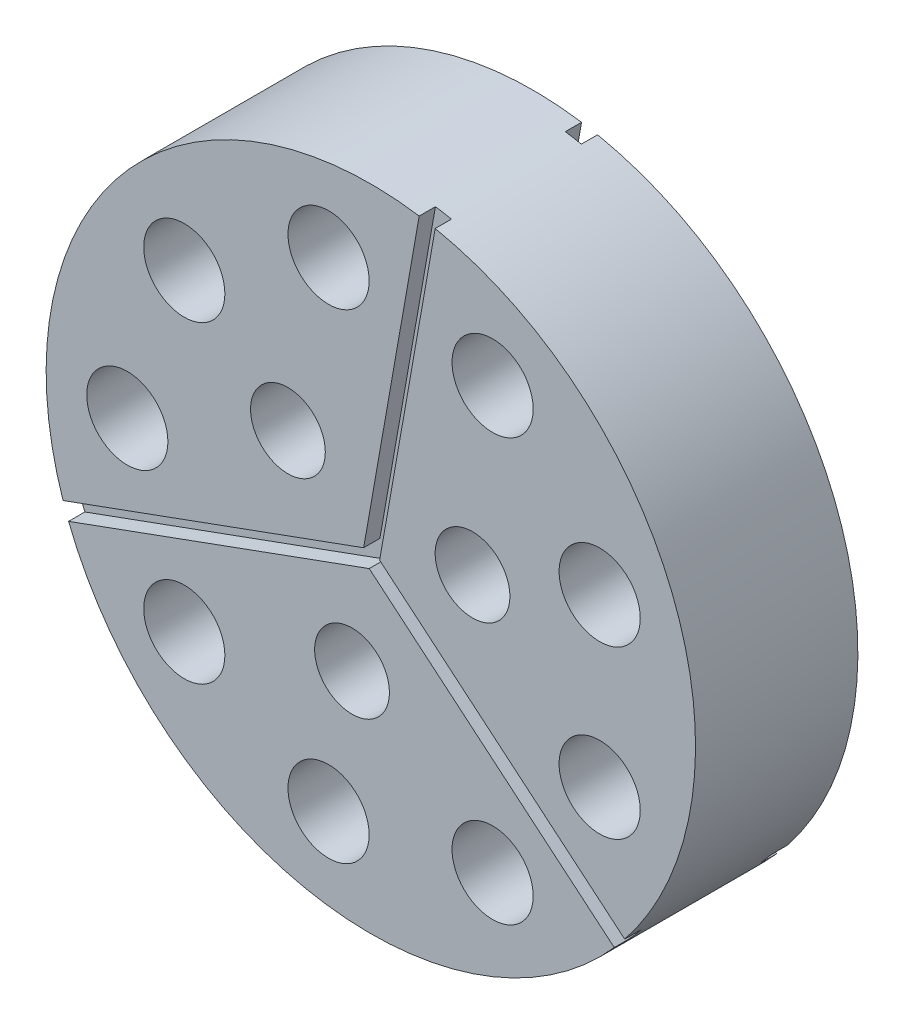
ISO-10303-21;
HEADER;
FILE_DESCRIPTION(('STEP AP214'),'2;1');
FILE_NAME('part.step','',(''),(''),'','','');
FILE_SCHEMA(('AUTOMOTIVE_DESIGN { 1 0 10303 214 1 1 1 1 }'));
ENDSEC;
DATA;
#1=APPLICATION_CONTEXT('core data for automotive mechanical design processes');
#2=APPLICATION_PROTOCOL_DEFINITION('international standard','automotive_design',2000,#1);
#3=PRODUCT_CONTEXT('',#1,'mechanical');
#4=PRODUCT('Part','Part','',(#3));
#5=PRODUCT_RELATED_PRODUCT_CATEGORY('part','',(#4));
#6=PRODUCT_DEFINITION_FORMATION('','',#4);
#7=PRODUCT_DEFINITION_CONTEXT('part definition',#1,'design');
#8=PRODUCT_DEFINITION('design','',#6,#7);
#9=PRODUCT_DEFINITION_SHAPE('','',#8);
#10=(LENGTH_UNIT() NAMED_UNIT(*) SI_UNIT(.MILLI.,.METRE.));
#11=(NAMED_UNIT(*) PLANE_ANGLE_UNIT() SI_UNIT($,.RADIAN.));
#12=(NAMED_UNIT(*) SI_UNIT($,.STERADIAN.) SOLID_ANGLE_UNIT());
#13=UNCERTAINTY_MEASURE_WITH_UNIT(LENGTH_MEASURE(1.E-05),#10,'distance_accuracy_value','');
#14=(GEOMETRIC_REPRESENTATION_CONTEXT(3) GLOBAL_UNCERTAINTY_ASSIGNED_CONTEXT((#13)) GLOBAL_UNIT_ASSIGNED_CONTEXT((#10,
#11,#12)) REPRESENTATION_CONTEXT('',''));
#15=CARTESIAN_POINT('',(0.,0.,0.));
#16=DIRECTION('',(0.,0.,1.));
#17=DIRECTION('',(1.,0.,0.));
#18=AXIS2_PLACEMENT_3D('',#15,#16,#17);
#19=CARTESIAN_POINT('',(0.,0.,10.));
#20=DIRECTION('',(0.,0.,-1.));
#21=DIRECTION('',(-1.,0.,0.));
#22=AXIS2_PLACEMENT_3D('',#19,#20,#21);
#23=CYLINDRICAL_SURFACE('',#22,19.9999999999996);
#24=DIRECTION('',(0.,0.,1.));
#25=VECTOR('',#24,1.);
#26=CARTESIAN_POINT('',(2.97947420609077,19.7768231385939,9.));
#27=LINE('',#26,#25);
#28=CARTESIAN_POINT('',(2.97947420609077,19.7768231385939,9.));
#29=VERTEX_POINT('',#28);
#30=CARTESIAN_POINT('',(2.97947420609077,19.7768231385939,10.));
#31=VERTEX_POINT('',#30);
#32=EDGE_CURVE('E342',#29,#31,#27,.T.);
#33=ORIENTED_EDGE('',*,*,#32,.F.);
#34=CARTESIAN_POINT('',(0.,0.,9.));
#35=DIRECTION('',(0.,0.,1.));
#36=DIRECTION('',(1.,0.,0.));
#37=AXIS2_PLACEMENT_3D('',#34,#35,#36);
#38=CIRCLE('',#37,19.9999999999996);
#39=CARTESIAN_POINT('',(3.96428195910297,19.603174960927,9.));
#40=VERTEX_POINT('',#39);
#41=EDGE_CURVE('E282',#40,#29,#38,.T.);
#42=ORIENTED_EDGE('',*,*,#41,.F.);
#43=DIRECTION('',(0.,0.,1.));
#44=VECTOR('',#43,1.);
#45=CARTESIAN_POINT('',(3.96428195910297,19.603174960927,9.));
#46=LINE('',#45,#44);
#47=CARTESIAN_POINT('',(3.96428195910297,19.603174960927,10.));
#48=VERTEX_POINT('',#47);
#49=EDGE_CURVE('E345',#40,#48,#46,.T.);
#50=ORIENTED_EDGE('',*,*,#49,.T.);
#51=CARTESIAN_POINT('',(0.,0.,10.));
#52=DIRECTION('',(0.,0.,1.));
#53=DIRECTION('',(1.,0.,0.));
#54=AXIS2_PLACEMENT_3D('',#51,#52,#53);
#55=CIRCLE('',#54,19.9999999999996);
#56=CARTESIAN_POINT('',(15.6374941411288,-12.468711921692,10.));
#57=VERTEX_POINT('',#56);
#58=EDGE_CURVE('E56',#57,#48,#55,.T.);
#59=ORIENTED_EDGE('',*,*,#58,.F.);
#60=DIRECTION('',(0.,0.,1.));
#61=VECTOR('',#60,1.);
#62=CARTESIAN_POINT('',(15.6374941411288,-12.468711921692,9.));
#63=LINE('',#62,#61);
#64=CARTESIAN_POINT('',(15.6374941411288,-12.468711921692,9.));
#65=VERTEX_POINT('',#64);
#66=EDGE_CURVE('E321',#65,#57,#63,.T.);
#67=ORIENTED_EDGE('',*,*,#66,.F.);
#68=CARTESIAN_POINT('',(14.9947065314423,-13.234756364811,9.));
#69=VERTEX_POINT('',#68);
#70=EDGE_CURVE('E287',#69,#65,#38,.T.);
#71=ORIENTED_EDGE('',*,*,#70,.F.);
#72=DIRECTION('',(0.,0.,1.));
#73=VECTOR('',#72,1.);
#74=CARTESIAN_POINT('',(14.9947065314423,-13.234756364811,9.));
#75=LINE('',#74,#73);
#76=CARTESIAN_POINT('',(14.9947065314423,-13.234756364811,10.));
#77=VERTEX_POINT('',#76);
#78=EDGE_CURVE('E325',#69,#77,#75,.T.);
#79=ORIENTED_EDGE('',*,*,#78,.T.);
#80=CARTESIAN_POINT('',(-18.6169683472196,-7.30811121690187,10.));
#81=VERTEX_POINT('',#80);
#82=EDGE_CURVE('E54',#81,#77,#55,.T.);
#83=ORIENTED_EDGE('',*,*,#82,.F.);
#84=DIRECTION('',(0.,0.,1.));
#85=VECTOR('',#84,1.);
#86=CARTESIAN_POINT('',(-18.6169683472196,-7.30811121690187,9.));
#87=LINE('',#86,#85);
#88=CARTESIAN_POINT('',(-18.6169683472196,-7.30811121690187,9.));
#89=VERTEX_POINT('',#88);
#90=EDGE_CURVE('E332',#89,#81,#87,.T.);
#91=ORIENTED_EDGE('',*,*,#90,.F.);
#92=CARTESIAN_POINT('',(-18.9589884905453,-6.36841859611596,9.));
#93=VERTEX_POINT('',#92);
#94=EDGE_CURVE('E288',#93,#89,#38,.T.);
#95=ORIENTED_EDGE('',*,*,#94,.F.);
#96=DIRECTION('',(0.,0.,1.));
#97=VECTOR('',#96,1.);
#98=CARTESIAN_POINT('',(-18.9589884905453,-6.36841859611596,9.));
#99=LINE('',#98,#97);
#100=CARTESIAN_POINT('',(-18.9589884905453,-6.36841859611596,10.));
#101=VERTEX_POINT('',#100);
#102=EDGE_CURVE('E335',#93,#101,#99,.T.);
#103=ORIENTED_EDGE('',*,*,#102,.T.);
#104=EDGE_CURVE('E11',#31,#101,#55,.T.);
#105=ORIENTED_EDGE('',*,*,#104,.F.);
#106=EDGE_LOOP('',(#33,#42,#50,#59,#67,#71,#79,#83,#91,#95,#103,#105));
#107=FACE_BOUND('',#106,.T.);
#108=DIRECTION('',(0.,0.,-1.));
#109=VECTOR('',#108,1.);
#110=CARTESIAN_POINT('',(3.96428195910297,19.603174960927,1.));
#111=LINE('',#110,#109);
#112=CARTESIAN_POINT('',(3.96428195910297,19.603174960927,1.));
#113=VERTEX_POINT('',#112);
#114=CARTESIAN_POINT('',(3.96428195910297,19.603174960927,0.));
#115=VERTEX_POINT('',#114);
#116=EDGE_CURVE('E252',#113,#115,#111,.T.);
#117=ORIENTED_EDGE('',*,*,#116,.F.);
#118=CARTESIAN_POINT('',(0.,0.,1.));
#119=DIRECTION('',(0.,0.,1.));
#120=DIRECTION('',(1.,0.,0.));
#121=AXIS2_PLACEMENT_3D('',#118,#119,#120);
#122=CIRCLE('',#121,19.9999999999996);
#123=CARTESIAN_POINT('',(2.97947420609077,19.7768231385939,1.));
#124=VERTEX_POINT('',#123);
#125=EDGE_CURVE('E203',#113,#124,#122,.T.);
#126=ORIENTED_EDGE('',*,*,#125,.T.);
#127=DIRECTION('',(0.,0.,-1.));
#128=VECTOR('',#127,1.);
#129=CARTESIAN_POINT('',(2.97947420609077,19.7768231385939,1.));
#130=LINE('',#129,#128);
#131=CARTESIAN_POINT('',(2.97947420609077,19.7768231385939,0.));
#132=VERTEX_POINT('',#131);
#133=EDGE_CURVE('E255',#124,#132,#130,.T.);
#134=ORIENTED_EDGE('',*,*,#133,.T.);
#135=CARTESIAN_POINT('',(0.,0.,0.));
#136=DIRECTION('',(0.,0.,1.));
#137=DIRECTION('',(1.,0.,0.));
#138=AXIS2_PLACEMENT_3D('',#135,#136,#137);
#139=CIRCLE('',#138,19.9999999999996);
#140=CARTESIAN_POINT('',(-18.9589884905453,-6.36841859611596,0.));
#141=VERTEX_POINT('',#140);
#142=EDGE_CURVE('E402',#132,#141,#139,.T.);
#143=ORIENTED_EDGE('',*,*,#142,.T.);
#144=DIRECTION('',(0.,0.,-1.));
#145=VECTOR('',#144,1.);
#146=CARTESIAN_POINT('',(-18.9589884905453,-6.36841859611596,1.));
#147=LINE('',#146,#145);
#148=CARTESIAN_POINT('',(-18.9589884905453,-6.36841859611596,1.));
#149=VERTEX_POINT('',#148);
#150=EDGE_CURVE('E262',#149,#141,#147,.T.);
#151=ORIENTED_EDGE('',*,*,#150,.F.);
#152=CARTESIAN_POINT('',(-18.6169683472196,-7.30811121690187,1.));
#153=VERTEX_POINT('',#152);
#154=EDGE_CURVE('E204',#149,#153,#122,.T.);
#155=ORIENTED_EDGE('',*,*,#154,.T.);
#156=DIRECTION('',(0.,0.,-1.));
#157=VECTOR('',#156,1.);
#158=CARTESIAN_POINT('',(-18.6169683472196,-7.30811121690187,1.));
#159=LINE('',#158,#157);
#160=CARTESIAN_POINT('',(-18.6169683472196,-7.30811121690187,0.));
#161=VERTEX_POINT('',#160);
#162=EDGE_CURVE('E265',#153,#161,#159,.T.);
#163=ORIENTED_EDGE('',*,*,#162,.T.);
#164=CARTESIAN_POINT('',(14.9947065314423,-13.234756364811,0.));
#165=VERTEX_POINT('',#164);
#166=EDGE_CURVE('E406',#161,#165,#139,.T.);
#167=ORIENTED_EDGE('',*,*,#166,.T.);
#168=DIRECTION('',(0.,0.,-1.));
#169=VECTOR('',#168,1.);
#170=CARTESIAN_POINT('',(14.9947065314423,-13.234756364811,1.));
#171=LINE('',#170,#169);
#172=CARTESIAN_POINT('',(14.9947065314423,-13.234756364811,1.));
#173=VERTEX_POINT('',#172);
#174=EDGE_CURVE('E63',#173,#165,#171,.T.);
#175=ORIENTED_EDGE('',*,*,#174,.F.);
#176=CARTESIAN_POINT('',(15.6374941411288,-12.468711921692,1.));
#177=VERTEX_POINT('',#176);
#178=EDGE_CURVE('E193',#173,#177,#122,.T.);
#179=ORIENTED_EDGE('',*,*,#178,.T.);
#180=DIRECTION('',(0.,0.,-1.));
#181=VECTOR('',#180,1.);
#182=CARTESIAN_POINT('',(15.6374941411288,-12.468711921692,1.));
#183=LINE('',#182,#181);
#184=CARTESIAN_POINT('',(15.6374941411288,-12.468711921692,0.));
#185=VERTEX_POINT('',#184);
#186=EDGE_CURVE('E174',#177,#185,#183,.T.);
#187=ORIENTED_EDGE('',*,*,#186,.T.);
#188=EDGE_CURVE('E403',#185,#115,#139,.T.);
#189=ORIENTED_EDGE('',*,*,#188,.T.);
#190=EDGE_LOOP('',(#117,#126,#134,#143,#151,#155,#163,#167,#175,#179,#187,#189));
#191=FACE_BOUND('',#190,.T.);
#192=ADVANCED_FACE('F45',(#107,#191),#23,.T.);
#193=CARTESIAN_POINT('',(0.,0.,0.));
#194=DIRECTION('',(0.,0.,1.));
#195=DIRECTION('',(1.,0.,0.));
#196=AXIS2_PLACEMENT_3D('',#193,#194,#195);
#197=PLANE('',#196);
#198=CARTESIAN_POINT('',(7.50000000000006,12.9903810567666,0.));
#199=DIRECTION('',(0.,0.,1.));
#200=DIRECTION('',(1.,0.,0.));
#201=AXIS2_PLACEMENT_3D('',#198,#199,#200);
#202=CIRCLE('',#201,2.5);
#203=CARTESIAN_POINT('',(10.0000000000001,12.9903810567666,0.));
#204=VERTEX_POINT('',#203);
#205=EDGE_CURVE('E442',#204,#204,#202,.T.);
#206=ORIENTED_EDGE('',*,*,#205,.T.);
#207=EDGE_LOOP('',(#206));
#208=FACE_BOUND('',#207,.T.);
#209=CARTESIAN_POINT('',(14.0953893117887,5.13030214988495,0.));
#210=DIRECTION('',(0.,0.,1.));
#211=DIRECTION('',(1.,0.,0.));
#212=AXIS2_PLACEMENT_3D('',#209,#210,#211);
#213=CIRCLE('',#212,2.5);
#214=CARTESIAN_POINT('',(16.5953893117887,5.13030214988495,0.));
#215=VERTEX_POINT('',#214);
#216=EDGE_CURVE('E438',#215,#215,#213,.T.);
#217=ORIENTED_EDGE('',*,*,#216,.T.);
#218=EDGE_LOOP('',(#217));
#219=FACE_BOUND('',#218,.T.);
#220=CARTESIAN_POINT('',(14.0953893117886,-5.13030214988513,0.));
#221=DIRECTION('',(0.,0.,1.));
#222=DIRECTION('',(1.,0.,0.));
#223=AXIS2_PLACEMENT_3D('',#220,#221,#222);
#224=CIRCLE('',#223,2.5);
#225=CARTESIAN_POINT('',(16.5953893117886,-5.13030214988513,0.));
#226=VERTEX_POINT('',#225);
#227=EDGE_CURVE('E434',#226,#226,#224,.T.);
#228=ORIENTED_EDGE('',*,*,#227,.T.);
#229=EDGE_LOOP('',(#228));
#230=FACE_BOUND('',#229,.T.);
#231=CARTESIAN_POINT('',(6.26462060421488,2.28013542890542,0.));
#232=DIRECTION('',(0.,0.,1.));
#233=DIRECTION('',(1.,0.,0.));
#234=AXIS2_PLACEMENT_3D('',#231,#232,#233);
#235=CIRCLE('',#234,2.3024185050885);
#236=CARTESIAN_POINT('',(8.56703910930338,2.28013542890542,0.));
#237=VERTEX_POINT('',#236);
#238=EDGE_CURVE('E414',#237,#237,#235,.T.);
#239=ORIENTED_EDGE('',*,*,#238,.T.);
#240=EDGE_LOOP('',(#239));
#241=FACE_BOUND('',#240,.T.);
#242=DIRECTION('',(-0.766044443118976,0.642787609686542,0.));
#243=VECTOR('',#242,1.);
#244=CARTESIAN_POINT('',(0.321393804843268,0.383022221559484,0.));
#245=LINE('',#244,#243);
#246=CARTESIAN_POINT('',(0.542531787566249,0.197465421817342,0.));
#247=VERTEX_POINT('',#246);
#248=EDGE_CURVE('E181',#185,#247,#245,.T.);
#249=ORIENTED_EDGE('',*,*,#248,.T.);
#250=DIRECTION('',(0.173648177666934,0.984807753012208,0.));
#251=VECTOR('',#250,1.);
#252=CARTESIAN_POINT('',(0.492403876506104,-0.0868240888334669,0.));
#253=LINE('',#252,#251);
#254=EDGE_CURVE('E196',#247,#115,#253,.T.);
#255=ORIENTED_EDGE('',*,*,#254,.T.);
#256=ORIENTED_EDGE('',*,*,#188,.F.);
#257=EDGE_LOOP('',(#249,#255,#256));
#258=FACE_BOUND('',#257,.T.);
#259=ADVANCED_FACE('F474',(#208,#219,#230,#241,#258),#197,.F.);
#260=CARTESIAN_POINT('',(-1.15765509660634,-6.56538830277373,0.));
#261=DIRECTION('',(0.,0.,1.));
#262=DIRECTION('',(1.,0.,0.));
#263=AXIS2_PLACEMENT_3D('',#260,#261,#262);
#264=CIRCLE('',#263,2.30241850508825);
#265=CARTESIAN_POINT('',(1.14476340848192,-6.56538830277373,0.));
#266=VERTEX_POINT('',#265);
#267=EDGE_CURVE('E410',#266,#266,#264,.T.);
#268=ORIENTED_EDGE('',*,*,#267,.T.);
#269=EDGE_LOOP('',(#268));
#270=FACE_BOUND('',#269,.T.);
#271=CARTESIAN_POINT('',(-11.4906666467848,-9.64181414529795,0.));
#272=DIRECTION('',(0.,0.,1.));
#273=DIRECTION('',(1.,0.,0.));
#274=AXIS2_PLACEMENT_3D('',#271,#272,#273);
#275=CIRCLE('',#274,2.5);
#276=CARTESIAN_POINT('',(-8.99066664678478,-9.64181414529795,0.));
#277=VERTEX_POINT('',#276);
#278=EDGE_CURVE('E422',#277,#277,#275,.T.);
#279=ORIENTED_EDGE('',*,*,#278,.T.);
#280=EDGE_LOOP('',(#279));
#281=FACE_BOUND('',#280,.T.);
#282=CARTESIAN_POINT('',(-2.6047226650041,-14.7721162951831,0.));
#283=DIRECTION('',(0.,0.,1.));
#284=DIRECTION('',(1.,0.,0.));
#285=AXIS2_PLACEMENT_3D('',#282,#283,#284);
#286=CIRCLE('',#285,2.5);
#287=CARTESIAN_POINT('',(-0.104722665004106,-14.7721162951831,0.));
#288=VERTEX_POINT('',#287);
#289=EDGE_CURVE('E426',#288,#288,#286,.T.);
#290=ORIENTED_EDGE('',*,*,#289,.T.);
#291=EDGE_LOOP('',(#290));
#292=FACE_BOUND('',#291,.T.);
#293=CARTESIAN_POINT('',(7.49999999999988,-12.9903810567667,0.));
#294=DIRECTION('',(0.,0.,1.));
#295=DIRECTION('',(1.,0.,0.));
#296=AXIS2_PLACEMENT_3D('',#293,#294,#295);
#297=CIRCLE('',#296,2.5);
#298=CARTESIAN_POINT('',(9.99999999999988,-12.9903810567667,0.));
#299=VERTEX_POINT('',#298);
#300=EDGE_CURVE('E430',#299,#299,#297,.T.);
#301=ORIENTED_EDGE('',*,*,#300,.T.);
#302=EDGE_LOOP('',(#301));
#303=FACE_BOUND('',#302,.T.);
#304=DIRECTION('',(0.93969262078591,0.342020143325665,0.));
#305=VECTOR('',#304,1.);
#306=CARTESIAN_POINT('',(0.171010071662832,-0.469846310392954,0.));
#307=LINE('',#306,#305);
#308=CARTESIAN_POINT('',(-0.100255822120296,-0.568579021301629,0.));
#309=VERTEX_POINT('',#308);
#310=EDGE_CURVE('E235',#161,#309,#307,.T.);
#311=ORIENTED_EDGE('',*,*,#310,.T.);
#312=DIRECTION('',(0.766044443118976,-0.642787609686541,0.));
#313=VECTOR('',#312,1.);
#314=CARTESIAN_POINT('',(-0.321393804843272,-0.38302222155949,0.));
#315=LINE('',#314,#313);
#316=EDGE_CURVE('E232',#309,#165,#315,.T.);
#317=ORIENTED_EDGE('',*,*,#316,.T.);
#318=ORIENTED_EDGE('',*,*,#166,.F.);
#319=EDGE_LOOP('',(#311,#317,#318));
#320=FACE_BOUND('',#319,.T.);
#321=ADVANCED_FACE('F480',(#270,#281,#292,#303,#320),#197,.F.);
#322=CARTESIAN_POINT('',(0.,0.,10.));
#323=DIRECTION('',(0.,0.,1.));
#324=DIRECTION('',(1.,0.,0.));
#325=AXIS2_PLACEMENT_3D('',#322,#323,#324);
#326=PLANE('',#325);
#327=CARTESIAN_POINT('',(-11.4906666467847,9.64181414529811,10.));
#328=DIRECTION('',(0.,0.,1.));
#329=DIRECTION('',(1.,0.,0.));
#330=AXIS2_PLACEMENT_3D('',#327,#328,#329);
#331=CIRCLE('',#330,2.5);
#332=CARTESIAN_POINT('',(-8.99066664678466,9.64181414529811,10.));
#333=VERTEX_POINT('',#332);
#334=EDGE_CURVE('E364',#333,#333,#331,.T.);
#335=ORIENTED_EDGE('',*,*,#334,.F.);
#336=EDGE_LOOP('',(#335));
#337=FACE_BOUND('',#336,.T.);
#338=CARTESIAN_POINT('',(-2.60472266500392,14.7721162951831,10.));
#339=DIRECTION('',(0.,0.,1.));
#340=DIRECTION('',(1.,0.,0.));
#341=AXIS2_PLACEMENT_3D('',#338,#339,#340);
#342=CIRCLE('',#341,2.5);
#343=CARTESIAN_POINT('',(-0.104722665003915,14.7721162951831,10.));
#344=VERTEX_POINT('',#343);
#345=EDGE_CURVE('E369',#344,#344,#342,.T.);
#346=ORIENTED_EDGE('',*,*,#345,.F.);
#347=EDGE_LOOP('',(#346));
#348=FACE_BOUND('',#347,.T.);
#349=CARTESIAN_POINT('',(-5.10696550760799,4.28525287386897,10.));
#350=DIRECTION('',(0.,0.,1.));
#351=DIRECTION('',(1.,0.,0.));
#352=AXIS2_PLACEMENT_3D('',#349,#350,#351);
#353=CIRCLE('',#352,2.30241850508798);
#354=CARTESIAN_POINT('',(-2.80454700252001,4.28525287386897,10.));
#355=VERTEX_POINT('',#354);
#356=EDGE_CURVE('E352',#355,#355,#353,.T.);
#357=ORIENTED_EDGE('',*,*,#356,.F.);
#358=EDGE_LOOP('',(#357));
#359=FACE_BOUND('',#358,.T.);
#360=CARTESIAN_POINT('',(-15.,0.,10.));
#361=DIRECTION('',(0.,0.,1.));
#362=DIRECTION('',(1.,0.,0.));
#363=AXIS2_PLACEMENT_3D('',#360,#361,#362);
#364=CIRCLE('',#363,2.5);
#365=CARTESIAN_POINT('',(-12.5,0.,10.));
#366=VERTEX_POINT('',#365);
#367=EDGE_CURVE('E368',#366,#366,#364,.T.);
#368=ORIENTED_EDGE('',*,*,#367,.F.);
#369=EDGE_LOOP('',(#368));
#370=FACE_BOUND('',#369,.T.);
#371=ORIENTED_EDGE('',*,*,#104,.T.);
#372=DIRECTION('',(0.93969262078591,0.342020143325666,0.));
#373=VECTOR('',#372,1.);
#374=CARTESIAN_POINT('',(-0.171010071662834,0.469846310392958,10.));
#375=LINE('',#374,#373);
#376=CARTESIAN_POINT('',(-0.442275965445955,0.371113599484285,10.));
#377=VERTEX_POINT('',#376);
#378=EDGE_CURVE('E311',#101,#377,#375,.T.);
#379=ORIENTED_EDGE('',*,*,#378,.T.);
#380=DIRECTION('',(0.173648177666934,0.984807753012208,0.));
#381=VECTOR('',#380,1.);
#382=CARTESIAN_POINT('',(-0.492403876506102,0.0868240888334664,10.));
#383=LINE('',#382,#381);
#384=EDGE_CURVE('E307',#377,#31,#383,.T.);
#385=ORIENTED_EDGE('',*,*,#384,.T.);
#386=EDGE_LOOP('',(#371,#379,#385));
#387=FACE_BOUND('',#386,.T.);
#388=ADVANCED_FACE('F491',(#337,#348,#359,#370,#387),#326,.T.);
#389=DIRECTION('',(0.766044443118976,-0.642787609686541,0.));
#390=VECTOR('',#389,1.);
#391=CARTESIAN_POINT('',(-0.321393804843272,-0.38302222155949,10.));
#392=LINE('',#391,#390);
#393=CARTESIAN_POINT('',(-0.100255822120296,-0.568579021301629,10.));
#394=VERTEX_POINT('',#393);
#395=EDGE_CURVE('E278',#394,#77,#392,.T.);
#396=ORIENTED_EDGE('',*,*,#395,.F.);
#397=DIRECTION('',(0.93969262078591,0.342020143325665,0.));
#398=VECTOR('',#397,1.);
#399=CARTESIAN_POINT('',(0.171010071662832,-0.469846310392954,10.));
#400=LINE('',#399,#398);
#401=EDGE_CURVE('E315',#81,#394,#400,.T.);
#402=ORIENTED_EDGE('',*,*,#401,.F.);
#403=ORIENTED_EDGE('',*,*,#82,.T.);
#404=EDGE_LOOP('',(#396,#402,#403));
#405=FACE_BOUND('',#404,.T.);
#406=CARTESIAN_POINT('',(-1.15765509660634,-6.56538830277373,10.));
#407=DIRECTION('',(0.,0.,1.));
#408=DIRECTION('',(1.,0.,0.));
#409=AXIS2_PLACEMENT_3D('',#406,#407,#408);
#410=CIRCLE('',#409,2.30241850508825);
#411=CARTESIAN_POINT('',(1.14476340848192,-6.56538830277373,10.));
#412=VERTEX_POINT('',#411);
#413=EDGE_CURVE('E324',#412,#412,#410,.T.);
#414=ORIENTED_EDGE('',*,*,#413,.F.);
#415=EDGE_LOOP('',(#414));
#416=FACE_BOUND('',#415,.T.);
#417=CARTESIAN_POINT('',(-11.4906666467848,-9.64181414529795,10.));
#418=DIRECTION('',(0.,0.,1.));
#419=DIRECTION('',(1.,0.,0.));
#420=AXIS2_PLACEMENT_3D('',#417,#418,#419);
#421=CIRCLE('',#420,2.5);
#422=CARTESIAN_POINT('',(-8.99066664678478,-9.64181414529795,10.));
#423=VERTEX_POINT('',#422);
#424=EDGE_CURVE('E356',#423,#423,#421,.T.);
#425=ORIENTED_EDGE('',*,*,#424,.F.);
#426=EDGE_LOOP('',(#425));
#427=FACE_BOUND('',#426,.T.);
#428=CARTESIAN_POINT('',(-2.6047226650041,-14.7721162951831,10.));
#429=DIRECTION('',(0.,0.,1.));
#430=DIRECTION('',(1.,0.,0.));
#431=AXIS2_PLACEMENT_3D('',#428,#429,#430);
#432=CIRCLE('',#431,2.5);
#433=CARTESIAN_POINT('',(-0.104722665004106,-14.7721162951831,10.));
#434=VERTEX_POINT('',#433);
#435=EDGE_CURVE('E389',#434,#434,#432,.T.);
#436=ORIENTED_EDGE('',*,*,#435,.F.);
#437=EDGE_LOOP('',(#436));
#438=FACE_BOUND('',#437,.T.);
#439=CARTESIAN_POINT('',(7.49999999999988,-12.9903810567667,10.));
#440=DIRECTION('',(0.,0.,1.));
#441=DIRECTION('',(1.,0.,0.));
#442=AXIS2_PLACEMENT_3D('',#439,#440,#441);
#443=CIRCLE('',#442,2.5);
#444=CARTESIAN_POINT('',(9.99999999999988,-12.9903810567667,10.));
#445=VERTEX_POINT('',#444);
#446=EDGE_CURVE('E385',#445,#445,#443,.T.);
#447=ORIENTED_EDGE('',*,*,#446,.F.);
#448=EDGE_LOOP('',(#447));
#449=FACE_BOUND('',#448,.T.);
#450=ADVANCED_FACE('F779',(#405,#416,#427,#438,#449),#326,.T.);
#451=DIRECTION('',(-0.766044443118976,0.642787609686542,0.));
#452=VECTOR('',#451,1.);
#453=CARTESIAN_POINT('',(0.321393804843268,0.383022221559484,10.));
#454=LINE('',#453,#452);
#455=CARTESIAN_POINT('',(0.542531787566249,0.197465421817342,10.));
#456=VERTEX_POINT('',#455);
#457=EDGE_CURVE('E71',#57,#456,#454,.T.);
#458=ORIENTED_EDGE('',*,*,#457,.F.);
#459=ORIENTED_EDGE('',*,*,#58,.T.);
#460=DIRECTION('',(0.173648177666934,0.984807753012208,0.));
#461=VECTOR('',#460,1.);
#462=CARTESIAN_POINT('',(0.492403876506104,-0.0868240888334669,10.));
#463=LINE('',#462,#461);
#464=EDGE_CURVE('E304',#456,#48,#463,.T.);
#465=ORIENTED_EDGE('',*,*,#464,.F.);
#466=EDGE_LOOP('',(#458,#459,#465));
#467=FACE_BOUND('',#466,.T.);
#468=CARTESIAN_POINT('',(7.50000000000006,12.9903810567666,10.));
#469=DIRECTION('',(0.,0.,1.));
#470=DIRECTION('',(1.,0.,0.));
#471=AXIS2_PLACEMENT_3D('',#468,#469,#470);
#472=CIRCLE('',#471,2.5);
#473=CARTESIAN_POINT('',(10.0000000000001,12.9903810567666,10.));
#474=VERTEX_POINT('',#473);
#475=EDGE_CURVE('E373',#474,#474,#472,.T.);
#476=ORIENTED_EDGE('',*,*,#475,.F.);
#477=EDGE_LOOP('',(#476));
#478=FACE_BOUND('',#477,.T.);
#479=CARTESIAN_POINT('',(14.0953893117887,5.13030214988495,10.));
#480=DIRECTION('',(0.,0.,1.));
#481=DIRECTION('',(1.,0.,0.));
#482=AXIS2_PLACEMENT_3D('',#479,#480,#481);
#483=CIRCLE('',#482,2.5);
#484=CARTESIAN_POINT('',(16.5953893117887,5.13030214988495,10.));
#485=VERTEX_POINT('',#484);
#486=EDGE_CURVE('E377',#485,#485,#483,.T.);
#487=ORIENTED_EDGE('',*,*,#486,.F.);
#488=EDGE_LOOP('',(#487));
#489=FACE_BOUND('',#488,.T.);
#490=CARTESIAN_POINT('',(14.0953893117886,-5.13030214988513,10.));
#491=DIRECTION('',(0.,0.,1.));
#492=DIRECTION('',(1.,0.,0.));
#493=AXIS2_PLACEMENT_3D('',#490,#491,#492);
#494=CIRCLE('',#493,2.5);
#495=CARTESIAN_POINT('',(16.5953893117886,-5.13030214988513,10.));
#496=VERTEX_POINT('',#495);
#497=EDGE_CURVE('E381',#496,#496,#494,.T.);
#498=ORIENTED_EDGE('',*,*,#497,.F.);
#499=EDGE_LOOP('',(#498));
#500=FACE_BOUND('',#499,.T.);
#501=CARTESIAN_POINT('',(6.26462060421488,2.28013542890542,10.));
#502=DIRECTION('',(0.,0.,1.));
#503=DIRECTION('',(1.,0.,0.));
#504=AXIS2_PLACEMENT_3D('',#501,#502,#503);
#505=CIRCLE('',#504,2.3024185050885);
#506=CARTESIAN_POINT('',(8.56703910930338,2.28013542890542,10.));
#507=VERTEX_POINT('',#506);
#508=EDGE_CURVE('E357',#507,#507,#505,.T.);
#509=ORIENTED_EDGE('',*,*,#508,.F.);
#510=EDGE_LOOP('',(#509));
#511=FACE_BOUND('',#510,.T.);
#512=ADVANCED_FACE('F510',(#467,#478,#489,#500,#511),#326,.T.);
#513=CARTESIAN_POINT('',(-11.4906666467847,9.64181414529811,0.));
#514=DIRECTION('',(0.,0.,1.));
#515=DIRECTION('',(1.,0.,0.));
#516=AXIS2_PLACEMENT_3D('',#513,#514,#515);
#517=CIRCLE('',#516,2.5);
#518=CARTESIAN_POINT('',(-8.99066664678466,9.64181414529811,0.));
#519=VERTEX_POINT('',#518);
#520=EDGE_CURVE('E48',#519,#519,#517,.T.);
#521=ORIENTED_EDGE('',*,*,#520,.T.);
#522=EDGE_LOOP('',(#521));
#523=FACE_BOUND('',#522,.T.);
#524=CARTESIAN_POINT('',(-2.60472266500392,14.7721162951831,0.));
#525=DIRECTION('',(0.,0.,1.));
#526=DIRECTION('',(1.,0.,0.));
#527=AXIS2_PLACEMENT_3D('',#524,#525,#526);
#528=CIRCLE('',#527,2.5);
#529=CARTESIAN_POINT('',(-0.104722665003915,14.7721162951831,0.));
#530=VERTEX_POINT('',#529);
#531=EDGE_CURVE('E445',#530,#530,#528,.T.);
#532=ORIENTED_EDGE('',*,*,#531,.T.);
#533=EDGE_LOOP('',(#532));
#534=FACE_BOUND('',#533,.T.);
#535=CARTESIAN_POINT('',(-5.10696550760799,4.28525287386897,0.));
#536=DIRECTION('',(0.,0.,1.));
#537=DIRECTION('',(1.,0.,0.));
#538=AXIS2_PLACEMENT_3D('',#535,#536,#537);
#539=CIRCLE('',#538,2.30241850508798);
#540=CARTESIAN_POINT('',(-2.80454700252001,4.28525287386897,0.));
#541=VERTEX_POINT('',#540);
#542=EDGE_CURVE('E418',#541,#541,#539,.T.);
#543=ORIENTED_EDGE('',*,*,#542,.T.);
#544=EDGE_LOOP('',(#543));
#545=FACE_BOUND('',#544,.T.);
#546=CARTESIAN_POINT('',(-15.,0.,0.));
#547=DIRECTION('',(0.,0.,1.));
#548=DIRECTION('',(1.,0.,0.));
#549=AXIS2_PLACEMENT_3D('',#546,#547,#548);
#550=CIRCLE('',#549,2.5);
#551=CARTESIAN_POINT('',(-12.5,0.,0.));
#552=VERTEX_POINT('',#551);
#553=EDGE_CURVE('E398',#552,#552,#550,.T.);
#554=ORIENTED_EDGE('',*,*,#553,.T.);
#555=EDGE_LOOP('',(#554));
#556=FACE_BOUND('',#555,.T.);
#557=ORIENTED_EDGE('',*,*,#142,.F.);
#558=DIRECTION('',(0.173648177666934,0.984807753012208,0.));
#559=VECTOR('',#558,1.);
#560=CARTESIAN_POINT('',(-0.492403876506102,0.0868240888334664,0.));
#561=LINE('',#560,#559);
#562=CARTESIAN_POINT('',(-0.442275965445955,0.371113599484285,0.));
#563=VERTEX_POINT('',#562);
#564=EDGE_CURVE('E243',#563,#132,#561,.T.);
#565=ORIENTED_EDGE('',*,*,#564,.F.);
#566=DIRECTION('',(0.93969262078591,0.342020143325666,0.));
#567=VECTOR('',#566,1.);
#568=CARTESIAN_POINT('',(-0.171010071662834,0.469846310392958,0.));
#569=LINE('',#568,#567);
#570=EDGE_CURVE('E239',#141,#563,#569,.T.);
#571=ORIENTED_EDGE('',*,*,#570,.F.);
#572=EDGE_LOOP('',(#557,#565,#571));
#573=FACE_BOUND('',#572,.T.);
#574=ADVANCED_FACE('F454',(#523,#534,#545,#556,#573),#197,.F.);
#575=CARTESIAN_POINT('',(-15.,0.,-25.));
#576=DIRECTION('',(0.,0.,1.));
#577=DIRECTION('',(1.,0.,0.));
#578=AXIS2_PLACEMENT_3D('',#575,#576,#577);
#579=CYLINDRICAL_SURFACE('',#578,2.5);
#580=ORIENTED_EDGE('',*,*,#367,.T.);
#581=EDGE_LOOP('',(#580));
#582=FACE_BOUND('',#581,.T.);
#583=ORIENTED_EDGE('',*,*,#553,.F.);
#584=EDGE_LOOP('',(#583));
#585=FACE_BOUND('',#584,.T.);
#586=ADVANCED_FACE('F534',(#582,#585),#579,.F.);
#587=CARTESIAN_POINT('',(-1.15765509660634,-6.56538830277373,-25.));
#588=DIRECTION('',(0.,0.,1.));
#589=DIRECTION('',(1.,0.,0.));
#590=AXIS2_PLACEMENT_3D('',#587,#588,#589);
#591=CYLINDRICAL_SURFACE('',#590,2.30241850508825);
#592=ORIENTED_EDGE('',*,*,#413,.T.);
#593=EDGE_LOOP('',(#592));
#594=FACE_BOUND('',#593,.T.);
#595=ORIENTED_EDGE('',*,*,#267,.F.);
#596=EDGE_LOOP('',(#595));
#597=FACE_BOUND('',#596,.T.);
#598=ADVANCED_FACE('F531',(#594,#597),#591,.F.);
#599=CARTESIAN_POINT('',(6.26462060421488,2.28013542890542,-25.));
#600=DIRECTION('',(0.,0.,1.));
#601=DIRECTION('',(1.,0.,0.));
#602=AXIS2_PLACEMENT_3D('',#599,#600,#601);
#603=CYLINDRICAL_SURFACE('',#602,2.3024185050885);
#604=ORIENTED_EDGE('',*,*,#508,.T.);
#605=EDGE_LOOP('',(#604));
#606=FACE_BOUND('',#605,.T.);
#607=ORIENTED_EDGE('',*,*,#238,.F.);
#608=EDGE_LOOP('',(#607));
#609=FACE_BOUND('',#608,.T.);
#610=ADVANCED_FACE('F528',(#606,#609),#603,.F.);
#611=CARTESIAN_POINT('',(-5.10696550760799,4.28525287386897,-25.));
#612=DIRECTION('',(0.,0.,1.));
#613=DIRECTION('',(1.,0.,0.));
#614=AXIS2_PLACEMENT_3D('',#611,#612,#613);
#615=CYLINDRICAL_SURFACE('',#614,2.30241850508798);
#616=ORIENTED_EDGE('',*,*,#356,.T.);
#617=EDGE_LOOP('',(#616));
#618=FACE_BOUND('',#617,.T.);
#619=ORIENTED_EDGE('',*,*,#542,.F.);
#620=EDGE_LOOP('',(#619));
#621=FACE_BOUND('',#620,.T.);
#622=ADVANCED_FACE('F524',(#618,#621),#615,.F.);
#623=CARTESIAN_POINT('',(-11.4906666467848,-9.64181414529795,-25.));
#624=DIRECTION('',(0.,0.,1.));
#625=DIRECTION('',(1.,0.,0.));
#626=AXIS2_PLACEMENT_3D('',#623,#624,#625);
#627=CYLINDRICAL_SURFACE('',#626,2.5);
#628=ORIENTED_EDGE('',*,*,#424,.T.);
#629=EDGE_LOOP('',(#628));
#630=FACE_BOUND('',#629,.T.);
#631=ORIENTED_EDGE('',*,*,#278,.F.);
#632=EDGE_LOOP('',(#631));
#633=FACE_BOUND('',#632,.T.);
#634=ADVANCED_FACE('F527',(#630,#633),#627,.F.);
#635=CARTESIAN_POINT('',(-2.6047226650041,-14.7721162951831,-25.));
#636=DIRECTION('',(0.,0.,1.));
#637=DIRECTION('',(1.,0.,0.));
#638=AXIS2_PLACEMENT_3D('',#635,#636,#637);
#639=CYLINDRICAL_SURFACE('',#638,2.5);
#640=ORIENTED_EDGE('',*,*,#435,.T.);
#641=EDGE_LOOP('',(#640));
#642=FACE_BOUND('',#641,.T.);
#643=ORIENTED_EDGE('',*,*,#289,.F.);
#644=EDGE_LOOP('',(#643));
#645=FACE_BOUND('',#644,.T.);
#646=ADVANCED_FACE('F715',(#642,#645),#639,.F.);
#647=CARTESIAN_POINT('',(7.49999999999988,-12.9903810567667,-25.));
#648=DIRECTION('',(0.,0.,1.));
#649=DIRECTION('',(1.,0.,0.));
#650=AXIS2_PLACEMENT_3D('',#647,#648,#649);
#651=CYLINDRICAL_SURFACE('',#650,2.5);
#652=ORIENTED_EDGE('',*,*,#446,.T.);
#653=EDGE_LOOP('',(#652));
#654=FACE_BOUND('',#653,.T.);
#655=ORIENTED_EDGE('',*,*,#300,.F.);
#656=EDGE_LOOP('',(#655));
#657=FACE_BOUND('',#656,.T.);
#658=ADVANCED_FACE('F725',(#654,#657),#651,.F.);
#659=CARTESIAN_POINT('',(14.0953893117886,-5.13030214988513,-25.));
#660=DIRECTION('',(0.,0.,1.));
#661=DIRECTION('',(1.,0.,0.));
#662=AXIS2_PLACEMENT_3D('',#659,#660,#661);
#663=CYLINDRICAL_SURFACE('',#662,2.5);
#664=ORIENTED_EDGE('',*,*,#497,.T.);
#665=EDGE_LOOP('',(#664));
#666=FACE_BOUND('',#665,.T.);
#667=ORIENTED_EDGE('',*,*,#227,.F.);
#668=EDGE_LOOP('',(#667));
#669=FACE_BOUND('',#668,.T.);
#670=ADVANCED_FACE('F735',(#666,#669),#663,.F.);
#671=CARTESIAN_POINT('',(14.0953893117887,5.13030214988495,-25.));
#672=DIRECTION('',(0.,0.,1.));
#673=DIRECTION('',(1.,0.,0.));
#674=AXIS2_PLACEMENT_3D('',#671,#672,#673);
#675=CYLINDRICAL_SURFACE('',#674,2.5);
#676=ORIENTED_EDGE('',*,*,#486,.T.);
#677=EDGE_LOOP('',(#676));
#678=FACE_BOUND('',#677,.T.);
#679=ORIENTED_EDGE('',*,*,#216,.F.);
#680=EDGE_LOOP('',(#679));
#681=FACE_BOUND('',#680,.T.);
#682=ADVANCED_FACE('F745',(#678,#681),#675,.F.);
#683=CARTESIAN_POINT('',(7.50000000000006,12.9903810567666,-25.));
#684=DIRECTION('',(0.,0.,1.));
#685=DIRECTION('',(1.,0.,0.));
#686=AXIS2_PLACEMENT_3D('',#683,#684,#685);
#687=CYLINDRICAL_SURFACE('',#686,2.5);
#688=ORIENTED_EDGE('',*,*,#475,.T.);
#689=EDGE_LOOP('',(#688));
#690=FACE_BOUND('',#689,.T.);
#691=ORIENTED_EDGE('',*,*,#205,.F.);
#692=EDGE_LOOP('',(#691));
#693=FACE_BOUND('',#692,.T.);
#694=ADVANCED_FACE('F469',(#690,#693),#687,.F.);
#695=CARTESIAN_POINT('',(-2.60472266500392,14.7721162951831,-25.));
#696=DIRECTION('',(0.,0.,1.));
#697=DIRECTION('',(1.,0.,0.));
#698=AXIS2_PLACEMENT_3D('',#695,#696,#697);
#699=CYLINDRICAL_SURFACE('',#698,2.5);
#700=ORIENTED_EDGE('',*,*,#345,.T.);
#701=EDGE_LOOP('',(#700));
#702=FACE_BOUND('',#701,.T.);
#703=ORIENTED_EDGE('',*,*,#531,.F.);
#704=EDGE_LOOP('',(#703));
#705=FACE_BOUND('',#704,.T.);
#706=ADVANCED_FACE('F459',(#702,#705),#699,.F.);
#707=CARTESIAN_POINT('',(-11.4906666467847,9.64181414529811,-25.));
#708=DIRECTION('',(0.,0.,1.));
#709=DIRECTION('',(1.,0.,0.));
#710=AXIS2_PLACEMENT_3D('',#707,#708,#709);
#711=CYLINDRICAL_SURFACE('',#710,2.5);
#712=ORIENTED_EDGE('',*,*,#334,.T.);
#713=EDGE_LOOP('',(#712));
#714=FACE_BOUND('',#713,.T.);
#715=ORIENTED_EDGE('',*,*,#520,.F.);
#716=EDGE_LOOP('',(#715));
#717=FACE_BOUND('',#716,.T.);
#718=ADVANCED_FACE('F456',(#714,#717),#711,.F.);
#719=CARTESIAN_POINT('',(0.321393804843268,0.383022221559484,9.));
#720=DIRECTION('',(0.642787609686542,0.766044443118976,0.));
#721=DIRECTION('',(-0.766044443118976,0.642787609686542,0.));
#722=AXIS2_PLACEMENT_3D('',#719,#720,#721);
#723=PLANE('',#722);
#724=ORIENTED_EDGE('',*,*,#457,.T.);
#725=DIRECTION('',(0.,0.,1.));
#726=VECTOR('',#725,1.);
#727=CARTESIAN_POINT('',(0.542531787566249,0.197465421817342,9.));
#728=LINE('',#727,#726);
#729=CARTESIAN_POINT('',(0.542531787566249,0.197465421817342,9.));
#730=VERTEX_POINT('',#729);
#731=EDGE_CURVE('E349',#730,#456,#728,.T.);
#732=ORIENTED_EDGE('',*,*,#731,.F.);
#733=DIRECTION('',(-0.766044443118976,0.642787609686542,0.));
#734=VECTOR('',#733,1.);
#735=CARTESIAN_POINT('',(0.321393804843268,0.383022221559484,9.));
#736=LINE('',#735,#734);
#737=EDGE_CURVE('E273',#65,#730,#736,.T.);
#738=ORIENTED_EDGE('',*,*,#737,.F.);
#739=ORIENTED_EDGE('',*,*,#66,.T.);
#740=EDGE_LOOP('',(#724,#732,#738,#739));
#741=FACE_BOUND('',#740,.T.);
#742=ADVANCED_FACE('F458',(#741),#723,.F.);
#743=CARTESIAN_POINT('',(-0.321393804843272,-0.38302222155949,9.));
#744=DIRECTION('',(-0.642787609686541,-0.766044443118976,0.));
#745=DIRECTION('',(0.766044443118976,-0.642787609686541,0.));
#746=AXIS2_PLACEMENT_3D('',#743,#744,#745);
#747=PLANE('',#746);
#748=ORIENTED_EDGE('',*,*,#395,.T.);
#749=ORIENTED_EDGE('',*,*,#78,.F.);
#750=DIRECTION('',(0.766044443118976,-0.642787609686541,0.));
#751=VECTOR('',#750,1.);
#752=CARTESIAN_POINT('',(-0.321393804843272,-0.38302222155949,9.));
#753=LINE('',#752,#751);
#754=CARTESIAN_POINT('',(-0.100255822120296,-0.568579021301629,9.));
#755=VERTEX_POINT('',#754);
#756=EDGE_CURVE('E298',#755,#69,#753,.T.);
#757=ORIENTED_EDGE('',*,*,#756,.F.);
#758=DIRECTION('',(0.,0.,1.));
#759=VECTOR('',#758,1.);
#760=CARTESIAN_POINT('',(-0.100255822120296,-0.568579021301629,9.));
#761=LINE('',#760,#759);
#762=EDGE_CURVE('E329',#755,#394,#761,.T.);
#763=ORIENTED_EDGE('',*,*,#762,.T.);
#764=EDGE_LOOP('',(#748,#749,#757,#763));
#765=FACE_BOUND('',#764,.T.);
#766=ADVANCED_FACE('F467',(#765),#747,.F.);
#767=CARTESIAN_POINT('',(0.171010071662832,-0.469846310392954,9.));
#768=DIRECTION('',(0.342020143325665,-0.93969262078591,0.));
#769=DIRECTION('',(0.93969262078591,0.342020143325665,0.));
#770=AXIS2_PLACEMENT_3D('',#767,#768,#769);
#771=PLANE('',#770);
#772=ORIENTED_EDGE('',*,*,#401,.T.);
#773=ORIENTED_EDGE('',*,*,#762,.F.);
#774=DIRECTION('',(0.93969262078591,0.342020143325665,0.));
#775=VECTOR('',#774,1.);
#776=CARTESIAN_POINT('',(0.171010071662832,-0.469846310392954,9.));
#777=LINE('',#776,#775);
#778=EDGE_CURVE('E294',#89,#755,#777,.T.);
#779=ORIENTED_EDGE('',*,*,#778,.F.);
#780=ORIENTED_EDGE('',*,*,#90,.T.);
#781=EDGE_LOOP('',(#772,#773,#779,#780));
#782=FACE_BOUND('',#781,.T.);
#783=ADVANCED_FACE('F582',(#782),#771,.F.);
#784=CARTESIAN_POINT('',(-0.171010071662834,0.469846310392958,9.));
#785=DIRECTION('',(0.342020143325666,-0.93969262078591,0.));
#786=DIRECTION('',(0.93969262078591,0.342020143325666,0.));
#787=AXIS2_PLACEMENT_3D('',#784,#785,#786);
#788=PLANE('',#787);
#789=ORIENTED_EDGE('',*,*,#378,.F.);
#790=ORIENTED_EDGE('',*,*,#102,.F.);
#791=DIRECTION('',(0.93969262078591,0.342020143325666,0.));
#792=VECTOR('',#791,1.);
#793=CARTESIAN_POINT('',(-0.171010071662834,0.469846310392958,9.));
#794=LINE('',#793,#792);
#795=CARTESIAN_POINT('',(-0.442275965445955,0.371113599484285,9.));
#796=VERTEX_POINT('',#795);
#797=EDGE_CURVE('E291',#93,#796,#794,.T.);
#798=ORIENTED_EDGE('',*,*,#797,.T.);
#799=DIRECTION('',(0.,0.,1.));
#800=VECTOR('',#799,1.);
#801=CARTESIAN_POINT('',(-0.442275965445955,0.371113599484285,9.));
#802=LINE('',#801,#800);
#803=EDGE_CURVE('E339',#796,#377,#802,.T.);
#804=ORIENTED_EDGE('',*,*,#803,.T.);
#805=EDGE_LOOP('',(#789,#790,#798,#804));
#806=FACE_BOUND('',#805,.T.);
#807=ADVANCED_FACE('F493',(#806),#788,.T.);
#808=CARTESIAN_POINT('',(-0.492403876506102,0.0868240888334664,9.));
#809=DIRECTION('',(0.984807753012208,-0.173648177666934,0.));
#810=DIRECTION('',(0.173648177666934,0.984807753012208,0.));
#811=AXIS2_PLACEMENT_3D('',#808,#809,#810);
#812=PLANE('',#811);
#813=ORIENTED_EDGE('',*,*,#384,.F.);
#814=ORIENTED_EDGE('',*,*,#803,.F.);
#815=DIRECTION('',(0.173648177666934,0.984807753012208,0.));
#816=VECTOR('',#815,1.);
#817=CARTESIAN_POINT('',(-0.492403876506102,0.0868240888334664,9.));
#818=LINE('',#817,#816);
#819=EDGE_CURVE('E286',#796,#29,#818,.T.);
#820=ORIENTED_EDGE('',*,*,#819,.T.);
#821=ORIENTED_EDGE('',*,*,#32,.T.);
#822=EDGE_LOOP('',(#813,#814,#820,#821));
#823=FACE_BOUND('',#822,.T.);
#824=ADVANCED_FACE('F487',(#823),#812,.T.);
#825=CARTESIAN_POINT('',(0.492403876506104,-0.0868240888334669,9.));
#826=DIRECTION('',(0.984807753012207,-0.173648177666934,0.));
#827=DIRECTION('',(0.173648177666934,0.984807753012208,0.));
#828=AXIS2_PLACEMENT_3D('',#825,#826,#827);
#829=PLANE('',#828);
#830=ORIENTED_EDGE('',*,*,#464,.T.);
#831=ORIENTED_EDGE('',*,*,#49,.F.);
#832=DIRECTION('',(0.173648177666934,0.984807753012208,0.));
#833=VECTOR('',#832,1.);
#834=CARTESIAN_POINT('',(0.492403876506104,-0.0868240888334669,9.));
#835=LINE('',#834,#833);
#836=EDGE_CURVE('E277',#730,#40,#835,.T.);
#837=ORIENTED_EDGE('',*,*,#836,.F.);
#838=ORIENTED_EDGE('',*,*,#731,.T.);
#839=EDGE_LOOP('',(#830,#831,#837,#838));
#840=FACE_BOUND('',#839,.T.);
#841=ADVANCED_FACE('F513',(#840),#829,.F.);
#842=CARTESIAN_POINT('',(0.,0.,9.));
#843=DIRECTION('',(0.,0.,1.));
#844=DIRECTION('',(1.,0.,0.));
#845=AXIS2_PLACEMENT_3D('',#842,#843,#844);
#846=PLANE('',#845);
#847=ORIENTED_EDGE('',*,*,#737,.T.);
#848=ORIENTED_EDGE('',*,*,#836,.T.);
#849=ORIENTED_EDGE('',*,*,#41,.T.);
#850=ORIENTED_EDGE('',*,*,#819,.F.);
#851=ORIENTED_EDGE('',*,*,#797,.F.);
#852=ORIENTED_EDGE('',*,*,#94,.T.);
#853=ORIENTED_EDGE('',*,*,#778,.T.);
#854=ORIENTED_EDGE('',*,*,#756,.T.);
#855=ORIENTED_EDGE('',*,*,#70,.T.);
#856=EDGE_LOOP('',(#847,#848,#849,#850,#851,#852,#853,#854,#855));
#857=FACE_BOUND('',#856,.T.);
#858=ADVANCED_FACE('F505',(#857),#846,.T.);
#859=CARTESIAN_POINT('',(0.321393804843268,0.383022221559484,1.));
#860=DIRECTION('',(-0.642787609686542,-0.766044443118976,0.));
#861=DIRECTION('',(0.766044443118976,-0.642787609686542,0.));
#862=AXIS2_PLACEMENT_3D('',#859,#860,#861);
#863=PLANE('',#862);
#864=ORIENTED_EDGE('',*,*,#248,.F.);
#865=ORIENTED_EDGE('',*,*,#186,.F.);
#866=DIRECTION('',(-0.766044443118976,0.642787609686542,0.));
#867=VECTOR('',#866,1.);
#868=CARTESIAN_POINT('',(0.321393804843268,0.383022221559484,1.));
#869=LINE('',#868,#867);
#870=CARTESIAN_POINT('',(0.542531787566249,0.197465421817342,1.));
#871=VERTEX_POINT('',#870);
#872=EDGE_CURVE('E178',#177,#871,#869,.T.);
#873=ORIENTED_EDGE('',*,*,#872,.T.);
#874=DIRECTION('',(0.,0.,-1.));
#875=VECTOR('',#874,1.);
#876=CARTESIAN_POINT('',(0.542531787566249,0.197465421817342,1.));
#877=LINE('',#876,#875);
#878=EDGE_CURVE('E249',#871,#247,#877,.T.);
#879=ORIENTED_EDGE('',*,*,#878,.T.);
#880=EDGE_LOOP('',(#864,#865,#873,#879));
#881=FACE_BOUND('',#880,.T.);
#882=ADVANCED_FACE('F176',(#881),#863,.T.);
#883=CARTESIAN_POINT('',(0.492403876506104,-0.0868240888334669,1.));
#884=DIRECTION('',(-0.984807753012207,0.173648177666934,0.));
#885=DIRECTION('',(-0.173648177666934,-0.984807753012208,0.));
#886=AXIS2_PLACEMENT_3D('',#883,#884,#885);
#887=PLANE('',#886);
#888=ORIENTED_EDGE('',*,*,#254,.F.);
#889=ORIENTED_EDGE('',*,*,#878,.F.);
#890=DIRECTION('',(0.173648177666934,0.984807753012208,0.));
#891=VECTOR('',#890,1.);
#892=CARTESIAN_POINT('',(0.492403876506104,-0.0868240888334669,1.));
#893=LINE('',#892,#891);
#894=EDGE_CURVE('E187',#871,#113,#893,.T.);
#895=ORIENTED_EDGE('',*,*,#894,.T.);
#896=ORIENTED_EDGE('',*,*,#116,.T.);
#897=EDGE_LOOP('',(#888,#889,#895,#896));
#898=FACE_BOUND('',#897,.T.);
#899=ADVANCED_FACE('F578',(#898),#887,.T.);
#900=CARTESIAN_POINT('',(-0.492403876506102,0.0868240888334664,1.));
#901=DIRECTION('',(-0.984807753012208,0.173648177666934,0.));
#902=DIRECTION('',(-0.173648177666934,-0.984807753012208,0.));
#903=AXIS2_PLACEMENT_3D('',#900,#901,#902);
#904=PLANE('',#903);
#905=ORIENTED_EDGE('',*,*,#564,.T.);
#906=ORIENTED_EDGE('',*,*,#133,.F.);
#907=DIRECTION('',(0.173648177666934,0.984807753012208,0.));
#908=VECTOR('',#907,1.);
#909=CARTESIAN_POINT('',(-0.492403876506102,0.0868240888334664,1.));
#910=LINE('',#909,#908);
#911=CARTESIAN_POINT('',(-0.442275965445955,0.371113599484285,1.));
#912=VERTEX_POINT('',#911);
#913=EDGE_CURVE('E210',#912,#124,#910,.T.);
#914=ORIENTED_EDGE('',*,*,#913,.F.);
#915=DIRECTION('',(0.,0.,-1.));
#916=VECTOR('',#915,1.);
#917=CARTESIAN_POINT('',(-0.442275965445955,0.371113599484285,1.));
#918=LINE('',#917,#916);
#919=EDGE_CURVE('E259',#912,#563,#918,.T.);
#920=ORIENTED_EDGE('',*,*,#919,.T.);
#921=EDGE_LOOP('',(#905,#906,#914,#920));
#922=FACE_BOUND('',#921,.T.);
#923=ADVANCED_FACE('F638',(#922),#904,.F.);
#924=CARTESIAN_POINT('',(-0.171010071662834,0.469846310392958,1.));
#925=DIRECTION('',(-0.342020143325666,0.93969262078591,0.));
#926=DIRECTION('',(-0.93969262078591,-0.342020143325666,0.));
#927=AXIS2_PLACEMENT_3D('',#924,#925,#926);
#928=PLANE('',#927);
#929=ORIENTED_EDGE('',*,*,#570,.T.);
#930=ORIENTED_EDGE('',*,*,#919,.F.);
#931=DIRECTION('',(0.93969262078591,0.342020143325666,0.));
#932=VECTOR('',#931,1.);
#933=CARTESIAN_POINT('',(-0.171010071662834,0.469846310392958,1.));
#934=LINE('',#933,#932);
#935=EDGE_CURVE('E213',#149,#912,#934,.T.);
#936=ORIENTED_EDGE('',*,*,#935,.F.);
#937=ORIENTED_EDGE('',*,*,#150,.T.);
#938=EDGE_LOOP('',(#929,#930,#936,#937));
#939=FACE_BOUND('',#938,.T.);
#940=ADVANCED_FACE('F563',(#939),#928,.F.);
#941=CARTESIAN_POINT('',(0.171010071662832,-0.469846310392954,1.));
#942=DIRECTION('',(-0.342020143325665,0.93969262078591,0.));
#943=DIRECTION('',(-0.93969262078591,-0.342020143325665,0.));
#944=AXIS2_PLACEMENT_3D('',#941,#942,#943);
#945=PLANE('',#944);
#946=ORIENTED_EDGE('',*,*,#310,.F.);
#947=ORIENTED_EDGE('',*,*,#162,.F.);
#948=DIRECTION('',(0.93969262078591,0.342020143325665,0.));
#949=VECTOR('',#948,1.);
#950=CARTESIAN_POINT('',(0.171010071662832,-0.469846310392954,1.));
#951=LINE('',#950,#949);
#952=CARTESIAN_POINT('',(-0.100255822120296,-0.568579021301629,1.));
#953=VERTEX_POINT('',#952);
#954=EDGE_CURVE('E206',#153,#953,#951,.T.);
#955=ORIENTED_EDGE('',*,*,#954,.T.);
#956=DIRECTION('',(0.,0.,-1.));
#957=VECTOR('',#956,1.);
#958=CARTESIAN_POINT('',(-0.100255822120296,-0.568579021301629,1.));
#959=LINE('',#958,#957);
#960=EDGE_CURVE('E268',#953,#309,#959,.T.);
#961=ORIENTED_EDGE('',*,*,#960,.T.);
#962=EDGE_LOOP('',(#946,#947,#955,#961));
#963=FACE_BOUND('',#962,.T.);
#964=ADVANCED_FACE('F554',(#963),#945,.T.);
#965=CARTESIAN_POINT('',(-0.321393804843272,-0.38302222155949,1.));
#966=DIRECTION('',(0.642787609686541,0.766044443118976,0.));
#967=DIRECTION('',(-0.766044443118976,0.642787609686541,0.));
#968=AXIS2_PLACEMENT_3D('',#965,#966,#967);
#969=PLANE('',#968);
#970=ORIENTED_EDGE('',*,*,#316,.F.);
#971=ORIENTED_EDGE('',*,*,#960,.F.);
#972=DIRECTION('',(0.766044443118976,-0.642787609686541,0.));
#973=VECTOR('',#972,1.);
#974=CARTESIAN_POINT('',(-0.321393804843272,-0.38302222155949,1.));
#975=LINE('',#974,#973);
#976=EDGE_CURVE('E201',#953,#173,#975,.T.);
#977=ORIENTED_EDGE('',*,*,#976,.T.);
#978=ORIENTED_EDGE('',*,*,#174,.T.);
#979=EDGE_LOOP('',(#970,#971,#977,#978));
#980=FACE_BOUND('',#979,.T.);
#981=ADVANCED_FACE('F566',(#980),#969,.T.);
#982=CARTESIAN_POINT('',(0.,0.,1.));
#983=DIRECTION('',(0.,0.,-1.));
#984=DIRECTION('',(1.,0.,0.));
#985=AXIS2_PLACEMENT_3D('',#982,#983,#984);
#986=PLANE('',#985);
#987=ORIENTED_EDGE('',*,*,#872,.F.);
#988=ORIENTED_EDGE('',*,*,#178,.F.);
#989=ORIENTED_EDGE('',*,*,#976,.F.);
#990=ORIENTED_EDGE('',*,*,#954,.F.);
#991=ORIENTED_EDGE('',*,*,#154,.F.);
#992=ORIENTED_EDGE('',*,*,#935,.T.);
#993=ORIENTED_EDGE('',*,*,#913,.T.);
#994=ORIENTED_EDGE('',*,*,#125,.F.);
#995=ORIENTED_EDGE('',*,*,#894,.F.);
#996=EDGE_LOOP('',(#987,#988,#989,#990,#991,#992,#993,#994,#995));
#997=FACE_BOUND('',#996,.T.);
#998=ADVANCED_FACE('F191',(#997),#986,.T.);
#999=CLOSED_SHELL('',(#192,#259,#321,#388,#450,#512,#574,#586,#598,#610,#622,#634,#646,#658,
#670,#682,#694,#706,#718,#742,#766,#783,#807,#824,#841,#858,#882,#899,#923,#940,#964,#981,#998));
#1000=MANIFOLD_SOLID_BREP('B2',#999);
#1001=ADVANCED_BREP_SHAPE_REPRESENTATION('',(#18,#1000),#14);
#1002=SHAPE_DEFINITION_REPRESENTATION(#9,#1001);
ENDSEC;
END-ISO-10303-21;
